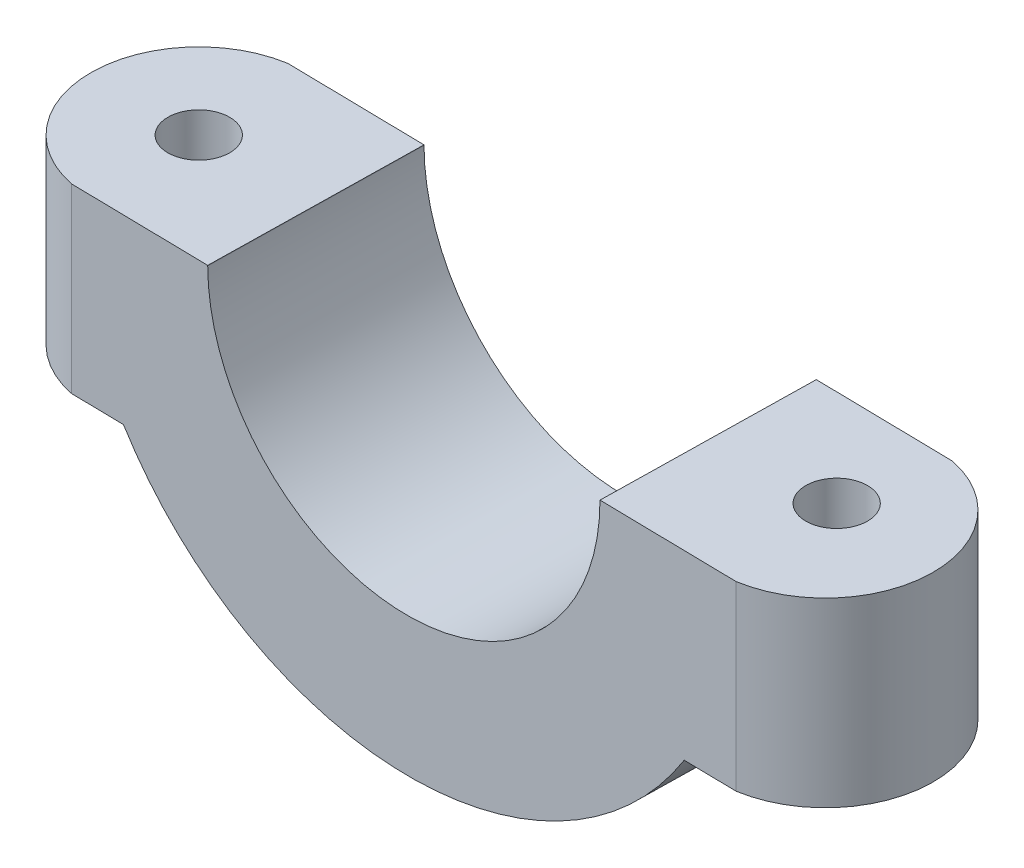
ISO-10303-21;
HEADER;
FILE_DESCRIPTION(('STEP AP214'),'2;1');
FILE_NAME('part.step','',(''),(''),'','','');
FILE_SCHEMA(('AUTOMOTIVE_DESIGN { 1 0 10303 214 1 1 1 1 }'));
ENDSEC;
DATA;
#1=APPLICATION_CONTEXT('core data for automotive mechanical design processes');
#2=APPLICATION_PROTOCOL_DEFINITION('international standard','automotive_design',2000,#1);
#3=PRODUCT_CONTEXT('',#1,'mechanical');
#4=PRODUCT('Part','Part','',(#3));
#5=PRODUCT_RELATED_PRODUCT_CATEGORY('part','',(#4));
#6=PRODUCT_DEFINITION_FORMATION('','',#4);
#7=PRODUCT_DEFINITION_CONTEXT('part definition',#1,'design');
#8=PRODUCT_DEFINITION('design','',#6,#7);
#9=PRODUCT_DEFINITION_SHAPE('','',#8);
#10=(LENGTH_UNIT() NAMED_UNIT(*) SI_UNIT(.MILLI.,.METRE.));
#11=(NAMED_UNIT(*) PLANE_ANGLE_UNIT() SI_UNIT($,.RADIAN.));
#12=(NAMED_UNIT(*) SI_UNIT($,.STERADIAN.) SOLID_ANGLE_UNIT());
#13=UNCERTAINTY_MEASURE_WITH_UNIT(LENGTH_MEASURE(1.E-05),#10,'distance_accuracy_value','');
#14=(GEOMETRIC_REPRESENTATION_CONTEXT(3) GLOBAL_UNCERTAINTY_ASSIGNED_CONTEXT((#13)) GLOBAL_UNIT_ASSIGNED_CONTEXT((#10,
#11,#12)) REPRESENTATION_CONTEXT('',''));
#15=CARTESIAN_POINT('',(0.,0.,0.));
#16=DIRECTION('',(0.,0.,1.));
#17=DIRECTION('',(1.,0.,0.));
#18=AXIS2_PLACEMENT_3D('',#15,#16,#17);
#19=CARTESIAN_POINT('',(-17.5642585339829,10.0011602048768,-0.312946842197242));
#20=DIRECTION('',(0.,-1.,0.));
#21=DIRECTION('',(0.,0.,-1.));
#22=AXIS2_PLACEMENT_3D('',#19,#20,#21);
#23=CYLINDRICAL_SURFACE('',#22,1.7);
#24=CARTESIAN_POINT('',(-17.5642585339829,10.,-0.312946842197242));
#25=DIRECTION('',(0.,1.,0.));
#26=DIRECTION('',(0.,0.,1.));
#27=AXIS2_PLACEMENT_3D('',#24,#25,#26);
#28=CIRCLE('',#27,1.7);
#29=CARTESIAN_POINT('',(-17.5642585339829,10.,1.38705315780276));
#30=VERTEX_POINT('',#29);
#31=EDGE_CURVE('E283',#30,#30,#28,.T.);
#32=ORIENTED_EDGE('',*,*,#31,.T.);
#33=EDGE_LOOP('',(#32));
#34=FACE_BOUND('',#33,.T.);
#35=CARTESIAN_POINT('',(-17.5642585339829,2.4,-0.312946842197242));
#36=DIRECTION('',(0.,-1.,0.));
#37=DIRECTION('',(0.,0.,-1.));
#38=AXIS2_PLACEMENT_3D('',#35,#36,#37);
#39=CIRCLE('',#38,1.7);
#40=CARTESIAN_POINT('',(-17.5642585339829,2.4,-2.01294684219724));
#41=VERTEX_POINT('',#40);
#42=EDGE_CURVE('E277',#41,#41,#39,.F.);
#43=ORIENTED_EDGE('',*,*,#42,.F.);
#44=EDGE_LOOP('',(#43));
#45=FACE_BOUND('',#44,.T.);
#46=ADVANCED_FACE('F35',(#34,#45),#23,.F.);
#47=CARTESIAN_POINT('',(0.851329498538715,10.,-47.5096853934283));
#48=DIRECTION('',(-0.0179161963788297,0.,0.99983949207226));
#49=DIRECTION('',(0.99983949207226,0.,0.0179161963788297));
#50=AXIS2_PLACEMENT_3D('',#47,#48,#49);
#51=CYLINDRICAL_SURFACE('',#50,18.6341884195745);
#52=CARTESIAN_POINT('',(-0.12045017804225,10.,6.72189801268763));
#53=DIRECTION('',(-0.5,0.,-0.866025403784439));
#54=DIRECTION('',(-0.866025403784439,0.,0.5));
#55=AXIS2_PLACEMENT_3D('',#52,#53,#54);
#56=ELLIPSE('',#55,21.7453296660283,18.6341884195745);
#57=CARTESIAN_POINT('',(14.8142585339829,-1.35115737945266,-1.90066008246871));
#58=VERTEX_POINT('',#57);
#59=CARTESIAN_POINT('',(15.7701150497485,0.,-2.45252409915266));
#60=VERTEX_POINT('',#59);
#61=EDGE_CURVE('E281',#58,#60,#56,.F.);
#62=ORIENTED_EDGE('',*,*,#61,.F.);
#63=CARTESIAN_POINT('',(14.8142585339829,10.,-826.731322589581));
#64=DIRECTION('',(-1.,0.,0.));
#65=DIRECTION('',(0.,0.,1.));
#66=AXIS2_PLACEMENT_3D('',#63,#64,#65);
#67=ELLIPSE('',#66,1040.07502628142,18.6341884195745);
#68=CARTESIAN_POINT('',(14.8142585339829,-1.27670473504071,1.27476639807423));
#69=VERTEX_POINT('',#68);
#70=EDGE_CURVE('E11',#69,#58,#67,.F.);
#71=ORIENTED_EDGE('',*,*,#70,.F.);
#72=CARTESIAN_POINT('',(0.129084035860714,10.,-7.20372305151324));
#73=DIRECTION('',(-0.5,0.,0.866025403784438));
#74=DIRECTION('',(0.866025403784438,0.,0.500000000000001));
#75=AXIS2_PLACEMENT_3D('',#72,#73,#74);
#76=ELLIPSE('',#75,21.3000006989995,18.6341884195745);
#77=CARTESIAN_POINT('',(15.6942217301498,0.,1.78281338625817));
#78=VERTEX_POINT('',#77);
#79=EDGE_CURVE('E279',#78,#69,#76,.F.);
#80=ORIENTED_EDGE('',*,*,#79,.F.);
#81=DIRECTION('',(-0.0179161963788297,0.,0.99983949207226));
#82=VECTOR('',#81,1.);
#83=CARTESIAN_POINT('',(16.5724496469144,0.,-47.2279775012048));
#84=LINE('',#83,#82);
#85=CARTESIAN_POINT('',(15.6162463227518,0.,6.13434482063357));
#86=VERTEX_POINT('',#85);
#87=EDGE_CURVE('E378',#86,#78,#84,.F.);
#88=ORIENTED_EDGE('',*,*,#87,.F.);
#89=CARTESIAN_POINT('',(-0.104873825623811,10.,5.85263692841008));
#90=DIRECTION('',(-0.0179161963788297,0.,0.99983949207226));
#91=DIRECTION('',(0.99983949207226,0.,0.0179161963788297));
#92=AXIS2_PLACEMENT_3D('',#89,#90,#91);
#93=CIRCLE('',#92,18.6341884195745);
#94=CARTESIAN_POINT('',(-15.8259939739995,0.,5.5709290361866));
#95=VERTEX_POINT('',#94);
#96=EDGE_CURVE('E351',#95,#86,#93,.T.);
#97=ORIENTED_EDGE('',*,*,#96,.F.);
#98=DIRECTION('',(-0.0179161963788297,0.,0.99983949207226));
#99=VECTOR('',#98,1.);
#100=CARTESIAN_POINT('',(-14.8697906498369,0.,-47.7913932856518));
#101=LINE('',#100,#99);
#102=CARTESIAN_POINT('',(-15.7587823722839,0.,1.82008749037332));
#103=VERTEX_POINT('',#102);
#104=EDGE_CURVE('E394',#95,#103,#101,.F.);
#105=ORIENTED_EDGE('',*,*,#104,.T.);
#106=CARTESIAN_POINT('',(0.131782855506878,10.,-7.35433462146697));
#107=DIRECTION('',(0.5,0.,0.866025403784439));
#108=DIRECTION('',(-0.866025403784439,0.,0.5));
#109=AXIS2_PLACEMENT_3D('',#106,#107,#108);
#110=ELLIPSE('',#109,21.7453296660283,18.6341884195745);
#111=CARTESIAN_POINT('',(-14.8142585339829,-1.33654364393422,1.27476639807423));
#112=VERTEX_POINT('',#111);
#113=EDGE_CURVE('E276',#112,#103,#110,.F.);
#114=ORIENTED_EDGE('',*,*,#113,.F.);
#115=CARTESIAN_POINT('',(-14.8142585339829,10.,826.731322589581));
#116=DIRECTION('',(1.,0.,0.));
#117=DIRECTION('',(0.,0.,1.));
#118=AXIS2_PLACEMENT_3D('',#115,#116,#117);
#119=ELLIPSE('',#118,1040.07502628142,18.6341884195745);
#120=CARTESIAN_POINT('',(-14.8142585339829,-1.26193774164251,-1.90066008246871));
#121=VERTEX_POINT('',#120);
#122=EDGE_CURVE('E43',#121,#112,#119,.F.);
#123=ORIENTED_EDGE('',*,*,#122,.F.);
#124=CARTESIAN_POINT('',(-0.117983443612844,10.,6.58423829704122));
#125=DIRECTION('',(0.5,0.,-0.866025403784438));
#126=DIRECTION('',(0.866025403784439,0.,0.5));
#127=AXIS2_PLACEMENT_3D('',#124,#125,#126);
#128=ELLIPSE('',#127,21.3000006989995,18.6341884195745);
#129=CARTESIAN_POINT('',(-15.6831211379019,0.,-2.40229814073019));
#130=VERTEX_POINT('',#129);
#131=EDGE_CURVE('E274',#130,#121,#128,.F.);
#132=ORIENTED_EDGE('',*,*,#131,.F.);
#133=CARTESIAN_POINT('',(-15.6163103944167,0.,-6.13076920784937));
#134=VERTEX_POINT('',#133);
#135=EDGE_CURVE('E383',#130,#134,#101,.F.);
#136=ORIENTED_EDGE('',*,*,#135,.T.);
#137=CARTESIAN_POINT('',(0.104809753958985,10.,-5.84906131562588));
#138=DIRECTION('',(-0.0179161963788298,0.,0.99983949207226));
#139=DIRECTION('',(0.99983949207226,0.,0.0179161963788298));
#140=AXIS2_PLACEMENT_3D('',#137,#138,#139);
#141=CIRCLE('',#140,18.6341884195745);
#142=CARTESIAN_POINT('',(15.8259299023346,0.,-5.5673534234024));
#143=VERTEX_POINT('',#142);
#144=EDGE_CURVE('E368',#143,#134,#141,.F.);
#145=ORIENTED_EDGE('',*,*,#144,.F.);
#146=EDGE_CURVE('E377',#60,#143,#84,.F.);
#147=ORIENTED_EDGE('',*,*,#146,.F.);
#148=EDGE_LOOP('',(#62,#71,#80,#88,#97,#105,#114,#123,#132,#136,#145,#147));
#149=FACE_BOUND('',#148,.T.);
#150=ADVANCED_FACE('F473',(#149),#51,.T.);
#151=CARTESIAN_POINT('',(0.851329498538715,10.,-47.5096853934283));
#152=DIRECTION('',(-0.0179161963788297,0.,0.99983949207226));
#153=DIRECTION('',(0.99983949207226,0.,0.0179161963788297));
#154=AXIS2_PLACEMENT_3D('',#151,#152,#153);
#155=CYLINDRICAL_SURFACE('',#154,11.);
#156=CARTESIAN_POINT('',(0.104809753958985,10.,-5.84906131562588));
#157=DIRECTION('',(-0.0179161963788298,0.,0.99983949207226));
#158=DIRECTION('',(0.99983949207226,0.,0.0179161963788298));
#159=AXIS2_PLACEMENT_3D('',#156,#157,#158);
#160=CIRCLE('',#159,11.);
#161=CARTESIAN_POINT('',(-10.8933926230034,9.97345003897609,-6.0461389017406));
#162=VERTEX_POINT('',#161);
#163=CARTESIAN_POINT('',(11.1030441667539,10.,-5.65198315545876));
#164=VERTEX_POINT('',#163);
#165=EDGE_CURVE('E343',#162,#164,#160,.T.);
#166=ORIENTED_EDGE('',*,*,#165,.F.);
#167=DIRECTION('',(-0.0179161963788297,0.,0.99983949207226));
#168=VECTOR('',#167,1.);
#169=CARTESIAN_POINT('',(-10.1468728784237,9.97345003897328,-47.706762979543));
#170=LINE('',#169,#168);
#171=CARTESIAN_POINT('',(-11.1030762025862,9.97345003897328,5.65555934229537));
#172=VERTEX_POINT('',#171);
#173=EDGE_CURVE('E381',#162,#172,#170,.T.);
#174=ORIENTED_EDGE('',*,*,#173,.T.);
#175=CARTESIAN_POINT('',(-0.104873825623811,10.,5.85263692841008));
#176=DIRECTION('',(0.0179161963788297,0.,-0.99983949207226));
#177=DIRECTION('',(0.99983949207226,0.,0.0179161963788297));
#178=AXIS2_PLACEMENT_3D('',#175,#176,#177);
#179=CIRCLE('',#178,11.);
#180=CARTESIAN_POINT('',(10.8933605871711,10.,6.04971508857721));
#181=VERTEX_POINT('',#180);
#182=EDGE_CURVE('E347',#181,#172,#179,.T.);
#183=ORIENTED_EDGE('',*,*,#182,.F.);
#184=DIRECTION('',(-0.0179161963788297,0.,0.99983949207226));
#185=VECTOR('',#184,1.);
#186=CARTESIAN_POINT('',(11.8495639113336,10.,-47.3126072332612));
#187=LINE('',#186,#185);
#188=EDGE_CURVE('E346',#164,#181,#187,.T.);
#189=ORIENTED_EDGE('',*,*,#188,.F.);
#190=EDGE_LOOP('',(#166,#174,#183,#189));
#191=FACE_BOUND('',#190,.T.);
#192=ADVANCED_FACE('F501',(#191),#155,.F.);
#193=CARTESIAN_POINT('',(17.5642585339831,10.,0.316523603086257));
#194=DIRECTION('',(0.,-1.,0.));
#195=DIRECTION('',(0.,0.,-1.));
#196=AXIS2_PLACEMENT_3D('',#193,#194,#195);
#197=CYLINDRICAL_SURFACE('',#196,5.94828404765475);
#198=CARTESIAN_POINT('',(17.5642585339831,0.,0.316523603086257));
#199=DIRECTION('',(0.,1.,0.));
#200=DIRECTION('',(0.,0.,1.));
#201=AXIS2_PLACEMENT_3D('',#198,#199,#200);
#202=CIRCLE('',#201,5.94828404765475);
#203=CARTESIAN_POINT('',(18.5263236589823,0.,6.18649070749529));
#204=VERTEX_POINT('',#203);
#205=CARTESIAN_POINT('',(18.7360072385651,0.,-5.51520753654067));
#206=VERTEX_POINT('',#205);
#207=EDGE_CURVE('E364',#204,#206,#202,.T.);
#208=ORIENTED_EDGE('',*,*,#207,.T.);
#209=DIRECTION('',(0.,-1.,0.));
#210=VECTOR('',#209,1.);
#211=CARTESIAN_POINT('',(18.7360072385651,10.,-5.51520753654067));
#212=LINE('',#211,#210);
#213=CARTESIAN_POINT('',(18.7360072385651,10.,-5.51520753654067));
#214=VERTEX_POINT('',#213);
#215=EDGE_CURVE('E374',#214,#206,#212,.T.);
#216=ORIENTED_EDGE('',*,*,#215,.F.);
#217=CARTESIAN_POINT('',(17.5642585339831,10.,0.316523603086257));
#218=DIRECTION('',(0.,1.,0.));
#219=DIRECTION('',(0.,0.,1.));
#220=AXIS2_PLACEMENT_3D('',#217,#218,#219);
#221=CIRCLE('',#220,5.94828404765475);
#222=CARTESIAN_POINT('',(18.5263236589823,10.,6.18649070749529));
#223=VERTEX_POINT('',#222);
#224=EDGE_CURVE('E354',#223,#214,#221,.T.);
#225=ORIENTED_EDGE('',*,*,#224,.F.);
#226=DIRECTION('',(0.,-1.,0.));
#227=VECTOR('',#226,1.);
#228=CARTESIAN_POINT('',(18.5263236589823,10.,6.18649070749529));
#229=LINE('',#228,#227);
#230=EDGE_CURVE('E363',#223,#204,#229,.T.);
#231=ORIENTED_EDGE('',*,*,#230,.T.);
#232=EDGE_LOOP('',(#208,#216,#225,#231));
#233=FACE_BOUND('',#232,.T.);
#234=ADVANCED_FACE('F37',(#233),#197,.T.);
#235=CARTESIAN_POINT('',(18.7360072385651,10.,-5.51520753654067));
#236=DIRECTION('',(-0.0179161963788298,0.,0.99983949207226));
#237=DIRECTION('',(0.99983949207226,0.,0.0179161963788298));
#238=AXIS2_PLACEMENT_3D('',#235,#236,#237);
#239=PLANE('',#238);
#240=DIRECTION('',(0.,-1.,0.));
#241=VECTOR('',#240,1.);
#242=CARTESIAN_POINT('',(-10.8933926230034,10.,-6.0461389017406));
#243=LINE('',#242,#241);
#244=CARTESIAN_POINT('',(-10.8933926230034,10.,-6.0461389017406));
#245=VERTEX_POINT('',#244);
#246=EDGE_CURVE('E487',#245,#162,#243,.T.);
#247=ORIENTED_EDGE('',*,*,#246,.T.);
#248=ORIENTED_EDGE('',*,*,#165,.T.);
#249=DIRECTION('',(-0.99983949207226,0.,-0.0179161963788298));
#250=VECTOR('',#249,1.);
#251=CARTESIAN_POINT('',(18.7360072385651,10.,-5.51520753654067));
#252=LINE('',#251,#250);
#253=EDGE_CURVE('E357',#214,#164,#252,.T.);
#254=ORIENTED_EDGE('',*,*,#253,.F.);
#255=ORIENTED_EDGE('',*,*,#215,.T.);
#256=DIRECTION('',(-0.99983949207226,0.,-0.0179161963788298));
#257=VECTOR('',#256,1.);
#258=CARTESIAN_POINT('',(18.7360072385651,0.,-5.51520753654067));
#259=LINE('',#258,#257);
#260=EDGE_CURVE('E367',#206,#143,#259,.T.);
#261=ORIENTED_EDGE('',*,*,#260,.T.);
#262=ORIENTED_EDGE('',*,*,#144,.T.);
#263=DIRECTION('',(-0.99983949207226,0.,-0.0179161963788298));
#264=VECTOR('',#263,1.);
#265=CARTESIAN_POINT('',(-10.8933926230034,0.,-6.0461389017406));
#266=LINE('',#265,#264);
#267=CARTESIAN_POINT('',(-18.5263236589821,0.,-6.18291394660628));
#268=VERTEX_POINT('',#267);
#269=EDGE_CURVE('E299',#134,#268,#266,.T.);
#270=ORIENTED_EDGE('',*,*,#269,.T.);
#271=DIRECTION('',(0.,-1.,0.));
#272=VECTOR('',#271,1.);
#273=CARTESIAN_POINT('',(-18.5263236589821,10.,-6.18291394660628));
#274=LINE('',#273,#272);
#275=CARTESIAN_POINT('',(-18.5263236589821,9.95113051891698,-6.18291394660628));
#276=VERTEX_POINT('',#275);
#277=EDGE_CURVE('E311',#276,#268,#274,.T.);
#278=ORIENTED_EDGE('',*,*,#277,.F.);
#279=CARTESIAN_POINT('',(-18.5263879400115,10.,-6.18290341083036));
#280=CARTESIAN_POINT('',(-18.5263852616376,9.99796377162161,-6.18290384983569));
#281=CARTESIAN_POINT('',(-18.5263825832635,9.99592754324322,-6.18290428883918));
#282=CARTESIAN_POINT('',(-18.5263772265147,9.99185508648644,-6.18290516684251));
#283=CARTESIAN_POINT('',(-18.52637454814,9.98981885810805,-6.18290560584234));
#284=CARTESIAN_POINT('',(-18.5263691913899,9.98574640135127,-6.18290648383833));
#285=CARTESIAN_POINT('',(-18.5263665130146,9.98371017297288,-6.18290692283449));
#286=CARTESIAN_POINT('',(-18.5263611562634,9.9796377162161,-6.18290780082315));
#287=CARTESIAN_POINT('',(-18.5263584778874,9.97760148783771,-6.18290823981565));
#288=CARTESIAN_POINT('',(-18.526353121135,9.97352903108093,-6.18290911779697));
#289=CARTESIAN_POINT('',(-18.5263504427585,9.97149280270255,-6.1829095567858));
#290=CARTESIAN_POINT('',(-18.5263450860048,9.96742034594577,-6.1829104347598));
#291=CARTESIAN_POINT('',(-18.5263424076277,9.96538411756738,-6.18291087374496));
#292=CARTESIAN_POINT('',(-18.5263370508728,9.9613116608106,-6.18291175171162));
#293=CARTESIAN_POINT('',(-18.5263343724951,9.95927543243221,-6.18291219069312));
#294=CARTESIAN_POINT('',(-18.5263290157391,9.95520297567543,-6.18291306865245));
#295=CARTESIAN_POINT('',(-18.5263263373607,9.95316674729704,-6.18291350763028));
#296=CARTESIAN_POINT('',(-18.5263236589821,9.95113051891865,-6.18291394660628));
#297=B_SPLINE_CURVE_WITH_KNOTS('',3,(#279,#280,#281,#282,#283,#284,#285,#286,#287,#288,#289,
#290,#291,#292,#293,#294,#295,#296),.UNSPECIFIED.,.F.,.F.,(4,2,2,2,2,2,2,2,4),(0.,
0.00610869056167826,0.0122173811233583,0.0183260716850365,0.0244347622467148,0.0305434528083931,
0.0366521433700713,0.0427608339317513,0.0488695244934296),.UNSPECIFIED.);
#298=CARTESIAN_POINT('',(-18.5263556948146,10.,-6.18291452065869));
#299=VERTEX_POINT('',#298);
#300=EDGE_CURVE('E305',#299,#276,#297,.T.);
#301=ORIENTED_EDGE('',*,*,#300,.F.);
#302=DIRECTION('',(0.99983949207226,0.,0.0179161963788298));
#303=VECTOR('',#302,1.);
#304=CARTESIAN_POINT('',(-10.8934246588359,10.,-6.04613947579301));
#305=LINE('',#304,#303);
#306=EDGE_CURVE('E345',#299,#245,#305,.T.);
#307=ORIENTED_EDGE('',*,*,#306,.T.);
#308=EDGE_LOOP('',(#247,#248,#254,#255,#261,#262,#270,#278,#301,#307));
#309=FACE_BOUND('',#308,.T.);
#310=ADVANCED_FACE('F408',(#309),#239,.F.);
#311=CARTESIAN_POINT('',(10.8933926230035,10.,6.04971566262962));
#312=DIRECTION('',(0.0179161963788297,0.,-0.99983949207226));
#313=DIRECTION('',(-0.99983949207226,0.,-0.0179161963788297));
#314=AXIS2_PLACEMENT_3D('',#311,#312,#313);
#315=PLANE('',#314);
#316=ORIENTED_EDGE('',*,*,#182,.T.);
#317=DIRECTION('',(0.,-1.,0.));
#318=VECTOR('',#317,1.);
#319=CARTESIAN_POINT('',(-11.1030762025862,10.,5.65555934229536));
#320=LINE('',#319,#318);
#321=CARTESIAN_POINT('',(-11.1030762025862,10.,5.65555934229536));
#322=VERTEX_POINT('',#321);
#323=EDGE_CURVE('E342',#322,#172,#320,.T.);
#324=ORIENTED_EDGE('',*,*,#323,.F.);
#325=DIRECTION('',(-0.99983949207226,0.,-0.0179161963788297));
#326=VECTOR('',#325,1.);
#327=CARTESIAN_POINT('',(-11.1031082384187,10.,5.65555876824296));
#328=LINE('',#327,#326);
#329=CARTESIAN_POINT('',(-18.736060363199,10.,5.51877362299413));
#330=VERTEX_POINT('',#329);
#331=EDGE_CURVE('E350',#322,#330,#328,.T.);
#332=ORIENTED_EDGE('',*,*,#331,.T.);
#333=CARTESIAN_POINT('',(-18.7360072385649,10.,5.51878429742968));
#334=DIRECTION('',(0.,-1.,0.));
#335=VECTOR('',#334,1.);
#336=LINE('',#333,#335);
#337=CARTESIAN_POINT('',(-18.7360072385649,9.95113051891976,5.51878429742968));
#338=VERTEX_POINT('',#337);
#339=EDGE_CURVE('E341',#330,#338,#336,.T.);
#340=ORIENTED_EDGE('',*,*,#339,.T.);
#341=DIRECTION('',(0.,-1.,0.));
#342=VECTOR('',#341,1.);
#343=CARTESIAN_POINT('',(-18.7360072385649,10.,5.51878429742968));
#344=LINE('',#343,#342);
#345=CARTESIAN_POINT('',(-18.7360072385649,0.,5.51878429742968));
#346=VERTEX_POINT('',#345);
#347=EDGE_CURVE('E334',#338,#346,#344,.T.);
#348=ORIENTED_EDGE('',*,*,#347,.T.);
#349=DIRECTION('',(0.99983949207226,0.,0.0179161963788302));
#350=VECTOR('',#349,1.);
#351=CARTESIAN_POINT('',(-18.7360072385649,0.,5.51878429742968));
#352=LINE('',#351,#350);
#353=EDGE_CURVE('E480',#346,#95,#352,.T.);
#354=ORIENTED_EDGE('',*,*,#353,.T.);
#355=ORIENTED_EDGE('',*,*,#96,.T.);
#356=DIRECTION('',(0.99983949207226,0.,0.0179161963788297));
#357=VECTOR('',#356,1.);
#358=CARTESIAN_POINT('',(10.8933926230035,0.,6.04971566262962));
#359=LINE('',#358,#357);
#360=EDGE_CURVE('E358',#86,#204,#359,.T.);
#361=ORIENTED_EDGE('',*,*,#360,.T.);
#362=ORIENTED_EDGE('',*,*,#230,.F.);
#363=DIRECTION('',(0.99983949207226,0.,0.0179161963788297));
#364=VECTOR('',#363,1.);
#365=CARTESIAN_POINT('',(10.8933926230035,10.,6.04971566262962));
#366=LINE('',#365,#364);
#367=EDGE_CURVE('E361',#181,#223,#366,.T.);
#368=ORIENTED_EDGE('',*,*,#367,.F.);
#369=EDGE_LOOP('',(#316,#324,#332,#340,#348,#354,#355,#361,#362,#368));
#370=FACE_BOUND('',#369,.T.);
#371=ADVANCED_FACE('F417',(#370),#315,.F.);
#372=CARTESIAN_POINT('',(17.5642585339831,10.,0.316523603086257));
#373=DIRECTION('',(0.,1.,0.));
#374=DIRECTION('',(0.,0.,1.));
#375=AXIS2_PLACEMENT_3D('',#372,#373,#374);
#376=PLANE('',#375);
#377=CARTESIAN_POINT('',(17.5642585339829,10.,-0.312946842197237));
#378=DIRECTION('',(0.,1.,0.));
#379=DIRECTION('',(0.,0.,1.));
#380=AXIS2_PLACEMENT_3D('',#377,#378,#379);
#381=CIRCLE('',#380,1.7);
#382=CARTESIAN_POINT('',(17.5642585339829,10.,1.38705315780276));
#383=VERTEX_POINT('',#382);
#384=EDGE_CURVE('E286',#383,#383,#381,.T.);
#385=ORIENTED_EDGE('',*,*,#384,.F.);
#386=EDGE_LOOP('',(#385));
#387=FACE_BOUND('',#386,.T.);
#388=ORIENTED_EDGE('',*,*,#224,.T.);
#389=ORIENTED_EDGE('',*,*,#253,.T.);
#390=ORIENTED_EDGE('',*,*,#188,.T.);
#391=ORIENTED_EDGE('',*,*,#367,.T.);
#392=EDGE_LOOP('',(#388,#389,#390,#391));
#393=FACE_BOUND('',#392,.T.);
#394=ADVANCED_FACE('F421',(#387,#393),#376,.T.);
#395=CARTESIAN_POINT('',(17.5642585339831,0.,0.316523603086257));
#396=DIRECTION('',(0.,1.,0.));
#397=DIRECTION('',(0.,0.,1.));
#398=AXIS2_PLACEMENT_3D('',#395,#396,#397);
#399=PLANE('',#398);
#400=DIRECTION('',(-0.866025403784439,0.,-0.5));
#401=VECTOR('',#400,1.);
#402=CARTESIAN_POINT('',(19.2118272322565,0.,-2.53714909128347));
#403=LINE('',#402,#401);
#404=CARTESIAN_POINT('',(20.3142585339829,0.,-1.90066008246871));
#405=VERTEX_POINT('',#404);
#406=CARTESIAN_POINT('',(17.5642585339829,0.,-3.48837332274018));
#407=VERTEX_POINT('',#406);
#408=EDGE_CURVE('E457',#405,#407,#403,.T.);
#409=ORIENTED_EDGE('',*,*,#408,.T.);
#410=DIRECTION('',(-0.866025403784439,0.,0.5));
#411=VECTOR('',#410,1.);
#412=CARTESIAN_POINT('',(15.9166898357095,0.,-2.53714909128366));
#413=LINE('',#412,#411);
#414=EDGE_CURVE('E460',#407,#60,#413,.T.);
#415=ORIENTED_EDGE('',*,*,#414,.T.);
#416=ORIENTED_EDGE('',*,*,#146,.T.);
#417=ORIENTED_EDGE('',*,*,#260,.F.);
#418=ORIENTED_EDGE('',*,*,#207,.F.);
#419=ORIENTED_EDGE('',*,*,#360,.F.);
#420=ORIENTED_EDGE('',*,*,#87,.T.);
#421=DIRECTION('',(0.866025403784438,0.,0.500000000000001));
#422=VECTOR('',#421,1.);
#423=CARTESIAN_POINT('',(16.4618272322565,0.,2.22599062953093));
#424=LINE('',#423,#422);
#425=CARTESIAN_POINT('',(17.5642585339829,0.,2.8624796383457));
#426=VERTEX_POINT('',#425);
#427=EDGE_CURVE('E453',#78,#426,#424,.T.);
#428=ORIENTED_EDGE('',*,*,#427,.T.);
#429=DIRECTION('',(0.866025403784439,0.,-0.5));
#430=VECTOR('',#429,1.);
#431=CARTESIAN_POINT('',(18.6666898357095,0.,2.22599062953074));
#432=LINE('',#431,#430);
#433=CARTESIAN_POINT('',(20.3142585339829,0.,1.27476639807423));
#434=VERTEX_POINT('',#433);
#435=EDGE_CURVE('E451',#426,#434,#432,.T.);
#436=ORIENTED_EDGE('',*,*,#435,.T.);
#437=DIRECTION('',(0.,0.,-1.));
#438=VECTOR('',#437,1.);
#439=CARTESIAN_POINT('',(20.3142585339829,0.,0.316523603086263));
#440=LINE('',#439,#438);
#441=EDGE_CURVE('E200',#434,#405,#440,.T.);
#442=ORIENTED_EDGE('',*,*,#441,.T.);
#443=EDGE_LOOP('',(#409,#415,#416,#417,#418,#419,#420,#428,#436,#442));
#444=FACE_BOUND('',#443,.T.);
#445=ADVANCED_FACE('F423',(#444),#399,.F.);
#446=CARTESIAN_POINT('',(-10.1469049142562,10.,-47.7067635535954));
#447=DIRECTION('',(0.,1.,0.));
#448=DIRECTION('',(0.,0.,1.));
#449=AXIS2_PLACEMENT_3D('',#446,#447,#448);
#450=PLANE('',#449);
#451=ORIENTED_EDGE('',*,*,#31,.F.);
#452=EDGE_LOOP('',(#451));
#453=FACE_BOUND('',#452,.T.);
#454=ORIENTED_EDGE('',*,*,#306,.F.);
#455=CARTESIAN_POINT('',(-17.5642585339829,10.,-0.312946842197242));
#456=DIRECTION('',(0.,1.,0.));
#457=DIRECTION('',(0.,0.,1.));
#458=AXIS2_PLACEMENT_3D('',#455,#456,#457);
#459=CIRCLE('',#458,5.94828404765475);
#460=EDGE_CURVE('E295',#299,#330,#459,.T.);
#461=ORIENTED_EDGE('',*,*,#460,.T.);
#462=ORIENTED_EDGE('',*,*,#331,.F.);
#463=DIRECTION('',(0.0179161963788299,0.,-0.99983949207226));
#464=VECTOR('',#463,1.);
#465=CARTESIAN_POINT('',(-11.1030762025862,10.,5.65555934229536));
#466=LINE('',#465,#464);
#467=EDGE_CURVE('E292',#322,#245,#466,.T.);
#468=ORIENTED_EDGE('',*,*,#467,.T.);
#469=EDGE_LOOP('',(#454,#461,#462,#468));
#470=FACE_BOUND('',#469,.T.);
#471=ADVANCED_FACE('F327',(#453,#470),#450,.T.);
#472=CARTESIAN_POINT('',(-11.1030762025862,10.,5.65555934229536));
#473=DIRECTION('',(-0.99983949207226,0.,-0.0179161963788299));
#474=DIRECTION('',(-0.0179161963788299,0.,0.99983949207226));
#475=AXIS2_PLACEMENT_3D('',#472,#473,#474);
#476=PLANE('',#475);
#477=ORIENTED_EDGE('',*,*,#173,.F.);
#478=ORIENTED_EDGE('',*,*,#246,.F.);
#479=ORIENTED_EDGE('',*,*,#467,.F.);
#480=ORIENTED_EDGE('',*,*,#323,.T.);
#481=EDGE_LOOP('',(#477,#478,#479,#480));
#482=FACE_BOUND('',#481,.T.);
#483=ADVANCED_FACE('F325',(#482),#476,.F.);
#484=CARTESIAN_POINT('',(-17.5642585339829,10.,-0.312946842197242));
#485=DIRECTION('',(0.,-1.,0.));
#486=DIRECTION('',(0.,0.,-1.));
#487=AXIS2_PLACEMENT_3D('',#484,#485,#486);
#488=CYLINDRICAL_SURFACE('',#487,5.94828404765475);
#489=ORIENTED_EDGE('',*,*,#339,.F.);
#490=ORIENTED_EDGE('',*,*,#460,.F.);
#491=ORIENTED_EDGE('',*,*,#300,.T.);
#492=ORIENTED_EDGE('',*,*,#277,.T.);
#493=CARTESIAN_POINT('',(-17.5642585339829,0.,-0.312946842197242));
#494=DIRECTION('',(0.,1.,0.));
#495=DIRECTION('',(0.,0.,1.));
#496=AXIS2_PLACEMENT_3D('',#493,#494,#495);
#497=CIRCLE('',#496,5.94828404765475);
#498=EDGE_CURVE('E289',#268,#346,#497,.T.);
#499=ORIENTED_EDGE('',*,*,#498,.T.);
#500=ORIENTED_EDGE('',*,*,#347,.F.);
#501=EDGE_LOOP('',(#489,#490,#491,#492,#499,#500));
#502=FACE_BOUND('',#501,.T.);
#503=ADVANCED_FACE('F314',(#502),#488,.T.);
#504=CARTESIAN_POINT('',(-17.5642585339829,0.,-0.312946842197242));
#505=DIRECTION('',(0.,1.,0.));
#506=DIRECTION('',(0.,0.,1.));
#507=AXIS2_PLACEMENT_3D('',#504,#505,#506);
#508=PLANE('',#507);
#509=DIRECTION('',(0.866025403784439,0.,0.5));
#510=VECTOR('',#509,1.);
#511=CARTESIAN_POINT('',(-18.9392585339829,0.,2.06862301820996));
#512=LINE('',#511,#510);
#513=CARTESIAN_POINT('',(-20.3142585339829,0.,1.27476639807423));
#514=VERTEX_POINT('',#513);
#515=CARTESIAN_POINT('',(-17.5642585339829,0.,2.8624796383457));
#516=VERTEX_POINT('',#515);
#517=EDGE_CURVE('E445',#514,#516,#512,.T.);
#518=ORIENTED_EDGE('',*,*,#517,.T.);
#519=DIRECTION('',(0.866025403784439,0.,-0.5));
#520=VECTOR('',#519,1.);
#521=CARTESIAN_POINT('',(-16.1892585339829,0.,2.06862301820996));
#522=LINE('',#521,#520);
#523=EDGE_CURVE('E448',#516,#103,#522,.T.);
#524=ORIENTED_EDGE('',*,*,#523,.T.);
#525=ORIENTED_EDGE('',*,*,#104,.F.);
#526=ORIENTED_EDGE('',*,*,#353,.F.);
#527=ORIENTED_EDGE('',*,*,#498,.F.);
#528=ORIENTED_EDGE('',*,*,#269,.F.);
#529=ORIENTED_EDGE('',*,*,#135,.F.);
#530=DIRECTION('',(-0.866025403784439,0.,-0.5));
#531=VECTOR('',#530,1.);
#532=CARTESIAN_POINT('',(-16.1892585339829,0.,-2.69451670260445));
#533=LINE('',#532,#531);
#534=CARTESIAN_POINT('',(-17.5642585339829,0.,-3.48837332274018));
#535=VERTEX_POINT('',#534);
#536=EDGE_CURVE('E397',#130,#535,#533,.T.);
#537=ORIENTED_EDGE('',*,*,#536,.T.);
#538=DIRECTION('',(-0.866025403784439,0.,0.5));
#539=VECTOR('',#538,1.);
#540=CARTESIAN_POINT('',(-18.9392585339829,0.,-2.69451670260445));
#541=LINE('',#540,#539);
#542=CARTESIAN_POINT('',(-20.3142585339829,0.,-1.90066008246871));
#543=VERTEX_POINT('',#542);
#544=EDGE_CURVE('E439',#535,#543,#541,.T.);
#545=ORIENTED_EDGE('',*,*,#544,.T.);
#546=DIRECTION('',(0.,0.,1.));
#547=VECTOR('',#546,1.);
#548=CARTESIAN_POINT('',(-20.3142585339829,0.,-0.312946842197242));
#549=LINE('',#548,#547);
#550=EDGE_CURVE('E442',#543,#514,#549,.T.);
#551=ORIENTED_EDGE('',*,*,#550,.T.);
#552=EDGE_LOOP('',(#518,#524,#525,#526,#527,#528,#529,#537,#545,#551));
#553=FACE_BOUND('',#552,.T.);
#554=ADVANCED_FACE('F324',(#553),#508,.F.);
#555=CARTESIAN_POINT('',(17.5642585339829,10.0011602048768,-0.312946842197237));
#556=DIRECTION('',(0.,-1.,0.));
#557=DIRECTION('',(0.,0.,-1.));
#558=AXIS2_PLACEMENT_3D('',#555,#556,#557);
#559=CYLINDRICAL_SURFACE('',#558,1.7);
#560=CARTESIAN_POINT('',(17.5642585339829,2.4,-0.312946842197237));
#561=DIRECTION('',(0.,1.,0.));
#562=DIRECTION('',(0.,0.,1.));
#563=AXIS2_PLACEMENT_3D('',#560,#561,#562);
#564=CIRCLE('',#563,1.7);
#565=CARTESIAN_POINT('',(17.5642585339829,2.4,1.38705315780276));
#566=VERTEX_POINT('',#565);
#567=EDGE_CURVE('E233',#566,#566,#564,.F.);
#568=ORIENTED_EDGE('',*,*,#567,.T.);
#569=EDGE_LOOP('',(#568));
#570=FACE_BOUND('',#569,.T.);
#571=ORIENTED_EDGE('',*,*,#384,.T.);
#572=EDGE_LOOP('',(#571));
#573=FACE_BOUND('',#572,.T.);
#574=ADVANCED_FACE('F534',(#570,#573),#559,.F.);
#575=CARTESIAN_POINT('',(20.3142585339829,2.4,1.27476639807423));
#576=DIRECTION('',(1.,0.,0.));
#577=DIRECTION('',(0.,0.,-1.));
#578=AXIS2_PLACEMENT_3D('',#575,#576,#577);
#579=PLANE('',#578);
#580=DIRECTION('',(0.,-1.,0.));
#581=VECTOR('',#580,1.);
#582=CARTESIAN_POINT('',(20.3142585339829,2.4,1.27476639807423));
#583=LINE('',#582,#581);
#584=CARTESIAN_POINT('',(20.3142585339829,2.4,1.27476639807423));
#585=VERTEX_POINT('',#584);
#586=EDGE_CURVE('E50',#585,#434,#583,.T.);
#587=ORIENTED_EDGE('',*,*,#586,.F.);
#588=DIRECTION('',(0.,0.,1.));
#589=VECTOR('',#588,1.);
#590=CARTESIAN_POINT('',(20.3142585339829,2.4,1.27476639807423));
#591=LINE('',#590,#589);
#592=CARTESIAN_POINT('',(20.3142585339829,2.4,-1.90066008246871));
#593=VERTEX_POINT('',#592);
#594=EDGE_CURVE('E197',#593,#585,#591,.T.);
#595=ORIENTED_EDGE('',*,*,#594,.F.);
#596=DIRECTION('',(0.,-1.,0.));
#597=VECTOR('',#596,1.);
#598=CARTESIAN_POINT('',(20.3142585339829,2.4,-1.90066008246871));
#599=LINE('',#598,#597);
#600=EDGE_CURVE('E231',#593,#405,#599,.T.);
#601=ORIENTED_EDGE('',*,*,#600,.T.);
#602=ORIENTED_EDGE('',*,*,#441,.F.);
#603=EDGE_LOOP('',(#587,#595,#601,#602));
#604=FACE_BOUND('',#603,.T.);
#605=ADVANCED_FACE('F194',(#604),#579,.F.);
#606=CARTESIAN_POINT('',(20.3142585339829,2.4,-1.90066008246871));
#607=DIRECTION('',(0.5,0.,-0.866025403784439));
#608=DIRECTION('',(-0.866025403784439,0.,-0.5));
#609=AXIS2_PLACEMENT_3D('',#606,#607,#608);
#610=PLANE('',#609);
#611=ORIENTED_EDGE('',*,*,#600,.F.);
#612=DIRECTION('',(0.866025403784439,0.,0.5));
#613=VECTOR('',#612,1.);
#614=CARTESIAN_POINT('',(20.3142585339829,2.4,-1.90066008246871));
#615=LINE('',#614,#613);
#616=CARTESIAN_POINT('',(17.5642585339829,2.4,-3.48837332274018));
#617=VERTEX_POINT('',#616);
#618=EDGE_CURVE('E203',#617,#593,#615,.T.);
#619=ORIENTED_EDGE('',*,*,#618,.F.);
#620=DIRECTION('',(0.,-1.,0.));
#621=VECTOR('',#620,1.);
#622=CARTESIAN_POINT('',(17.5642585339829,2.4,-3.48837332274018));
#623=LINE('',#622,#621);
#624=EDGE_CURVE('E234',#617,#407,#623,.T.);
#625=ORIENTED_EDGE('',*,*,#624,.T.);
#626=ORIENTED_EDGE('',*,*,#408,.F.);
#627=EDGE_LOOP('',(#611,#619,#625,#626));
#628=FACE_BOUND('',#627,.T.);
#629=ADVANCED_FACE('F553',(#628),#610,.F.);
#630=CARTESIAN_POINT('',(17.5642585339829,2.4,2.8624796383457));
#631=DIRECTION('',(0.5,0.,0.866025403784439));
#632=DIRECTION('',(0.866025403784439,0.,-0.5));
#633=AXIS2_PLACEMENT_3D('',#630,#631,#632);
#634=PLANE('',#633);
#635=DIRECTION('',(0.,-1.,0.));
#636=VECTOR('',#635,1.);
#637=CARTESIAN_POINT('',(17.5642585339829,2.4,2.8624796383457));
#638=LINE('',#637,#636);
#639=CARTESIAN_POINT('',(17.5642585339829,2.4,2.8624796383457));
#640=VERTEX_POINT('',#639);
#641=EDGE_CURVE('E202',#640,#426,#638,.T.);
#642=ORIENTED_EDGE('',*,*,#641,.F.);
#643=DIRECTION('',(-0.866025403784439,0.,0.5));
#644=VECTOR('',#643,1.);
#645=CARTESIAN_POINT('',(17.5642585339829,2.4,2.8624796383457));
#646=LINE('',#645,#644);
#647=EDGE_CURVE('E206',#585,#640,#646,.T.);
#648=ORIENTED_EDGE('',*,*,#647,.F.);
#649=ORIENTED_EDGE('',*,*,#586,.T.);
#650=ORIENTED_EDGE('',*,*,#435,.F.);
#651=EDGE_LOOP('',(#642,#648,#649,#650));
#652=FACE_BOUND('',#651,.T.);
#653=ADVANCED_FACE('F207',(#652),#634,.F.);
#654=CARTESIAN_POINT('',(0.,2.4,0.));
#655=DIRECTION('',(0.,1.,0.));
#656=DIRECTION('',(0.,0.,1.));
#657=AXIS2_PLACEMENT_3D('',#654,#655,#656);
#658=PLANE('',#657);
#659=ORIENTED_EDGE('',*,*,#594,.T.);
#660=ORIENTED_EDGE('',*,*,#647,.T.);
#661=DIRECTION('',(-0.866025403784438,0.,-0.500000000000001));
#662=VECTOR('',#661,1.);
#663=CARTESIAN_POINT('',(14.8142585339829,2.4,1.27476639807423));
#664=LINE('',#663,#662);
#665=CARTESIAN_POINT('',(14.8142585339829,2.4,1.27476639807423));
#666=VERTEX_POINT('',#665);
#667=EDGE_CURVE('E212',#640,#666,#664,.T.);
#668=ORIENTED_EDGE('',*,*,#667,.T.);
#669=DIRECTION('',(0.,0.,-1.));
#670=VECTOR('',#669,1.);
#671=CARTESIAN_POINT('',(14.8142585339829,2.4,-1.90066008246871));
#672=LINE('',#671,#670);
#673=CARTESIAN_POINT('',(14.8142585339829,2.4,-1.90066008246871));
#674=VERTEX_POINT('',#673);
#675=EDGE_CURVE('E225',#666,#674,#672,.T.);
#676=ORIENTED_EDGE('',*,*,#675,.T.);
#677=DIRECTION('',(0.866025403784439,0.,-0.5));
#678=VECTOR('',#677,1.);
#679=CARTESIAN_POINT('',(17.5642585339829,2.4,-3.48837332274018));
#680=LINE('',#679,#678);
#681=EDGE_CURVE('E228',#674,#617,#680,.T.);
#682=ORIENTED_EDGE('',*,*,#681,.T.);
#683=ORIENTED_EDGE('',*,*,#618,.T.);
#684=EDGE_LOOP('',(#659,#660,#668,#676,#682,#683));
#685=FACE_BOUND('',#684,.T.);
#686=ORIENTED_EDGE('',*,*,#567,.F.);
#687=EDGE_LOOP('',(#686));
#688=FACE_BOUND('',#687,.T.);
#689=ADVANCED_FACE('F214',(#685,#688),#658,.F.);
#690=CARTESIAN_POINT('',(17.5642585339829,2.4,-3.48837332274018));
#691=DIRECTION('',(-0.5,0.,-0.866025403784439));
#692=DIRECTION('',(-0.866025403784439,0.,0.5));
#693=AXIS2_PLACEMENT_3D('',#690,#691,#692);
#694=PLANE('',#693);
#695=ORIENTED_EDGE('',*,*,#61,.T.);
#696=ORIENTED_EDGE('',*,*,#414,.F.);
#697=ORIENTED_EDGE('',*,*,#624,.F.);
#698=ORIENTED_EDGE('',*,*,#681,.F.);
#699=DIRECTION('',(0.,-1.,0.));
#700=VECTOR('',#699,1.);
#701=CARTESIAN_POINT('',(14.8142585339829,2.4,-1.90066008246871));
#702=LINE('',#701,#700);
#703=EDGE_CURVE('E237',#674,#58,#702,.T.);
#704=ORIENTED_EDGE('',*,*,#703,.T.);
#705=EDGE_LOOP('',(#695,#696,#697,#698,#704));
#706=FACE_BOUND('',#705,.T.);
#707=ADVANCED_FACE('F573',(#706),#694,.F.);
#708=CARTESIAN_POINT('',(14.8142585339829,2.4,-1.90066008246871));
#709=DIRECTION('',(-1.,0.,0.));
#710=DIRECTION('',(0.,0.,1.));
#711=AXIS2_PLACEMENT_3D('',#708,#709,#710);
#712=PLANE('',#711);
#713=ORIENTED_EDGE('',*,*,#70,.T.);
#714=ORIENTED_EDGE('',*,*,#703,.F.);
#715=ORIENTED_EDGE('',*,*,#675,.F.);
#716=DIRECTION('',(0.,-1.,0.));
#717=VECTOR('',#716,1.);
#718=CARTESIAN_POINT('',(14.8142585339829,2.4,1.27476639807423));
#719=LINE('',#718,#717);
#720=EDGE_CURVE('E240',#666,#69,#719,.T.);
#721=ORIENTED_EDGE('',*,*,#720,.T.);
#722=EDGE_LOOP('',(#713,#714,#715,#721));
#723=FACE_BOUND('',#722,.T.);
#724=ADVANCED_FACE('F580',(#723),#712,.F.);
#725=CARTESIAN_POINT('',(14.8142585339829,2.4,1.27476639807423));
#726=DIRECTION('',(-0.5,0.,0.866025403784438));
#727=DIRECTION('',(0.866025403784438,0.,0.500000000000001));
#728=AXIS2_PLACEMENT_3D('',#725,#726,#727);
#729=PLANE('',#728);
#730=ORIENTED_EDGE('',*,*,#79,.T.);
#731=ORIENTED_EDGE('',*,*,#720,.F.);
#732=ORIENTED_EDGE('',*,*,#667,.F.);
#733=ORIENTED_EDGE('',*,*,#641,.T.);
#734=ORIENTED_EDGE('',*,*,#427,.F.);
#735=EDGE_LOOP('',(#730,#731,#732,#733,#734));
#736=FACE_BOUND('',#735,.T.);
#737=ADVANCED_FACE('F588',(#736),#729,.F.);
#738=CARTESIAN_POINT('',(-20.3142585339829,2.4,-1.90066008246871));
#739=DIRECTION('',(-0.5,0.,-0.866025403784439));
#740=DIRECTION('',(-0.866025403784439,0.,0.5));
#741=AXIS2_PLACEMENT_3D('',#738,#739,#740);
#742=PLANE('',#741);
#743=DIRECTION('',(0.,-1.,0.));
#744=VECTOR('',#743,1.);
#745=CARTESIAN_POINT('',(-17.5642585339829,2.4,-3.48837332274018));
#746=LINE('',#745,#744);
#747=CARTESIAN_POINT('',(-17.5642585339829,2.4,-3.48837332274018));
#748=VERTEX_POINT('',#747);
#749=EDGE_CURVE('E58',#748,#535,#746,.T.);
#750=ORIENTED_EDGE('',*,*,#749,.F.);
#751=DIRECTION('',(0.866025403784439,0.,-0.5));
#752=VECTOR('',#751,1.);
#753=CARTESIAN_POINT('',(-20.3142585339829,2.4,-1.90066008246871));
#754=LINE('',#753,#752);
#755=CARTESIAN_POINT('',(-20.3142585339829,2.4,-1.90066008246871));
#756=VERTEX_POINT('',#755);
#757=EDGE_CURVE('E244',#756,#748,#754,.T.);
#758=ORIENTED_EDGE('',*,*,#757,.F.);
#759=DIRECTION('',(0.,-1.,0.));
#760=VECTOR('',#759,1.);
#761=CARTESIAN_POINT('',(-20.3142585339829,2.4,-1.90066008246871));
#762=LINE('',#761,#760);
#763=EDGE_CURVE('E218',#756,#543,#762,.T.);
#764=ORIENTED_EDGE('',*,*,#763,.T.);
#765=ORIENTED_EDGE('',*,*,#544,.F.);
#766=EDGE_LOOP('',(#750,#758,#764,#765));
#767=FACE_BOUND('',#766,.T.);
#768=ADVANCED_FACE('F532',(#767),#742,.F.);
#769=CARTESIAN_POINT('',(-20.3142585339829,2.4,1.27476639807423));
#770=DIRECTION('',(-1.,0.,0.));
#771=DIRECTION('',(0.,0.,1.));
#772=AXIS2_PLACEMENT_3D('',#769,#770,#771);
#773=PLANE('',#772);
#774=ORIENTED_EDGE('',*,*,#763,.F.);
#775=DIRECTION('',(0.,0.,-1.));
#776=VECTOR('',#775,1.);
#777=CARTESIAN_POINT('',(-20.3142585339829,2.4,1.27476639807423));
#778=LINE('',#777,#776);
#779=CARTESIAN_POINT('',(-20.3142585339829,2.4,1.27476639807423));
#780=VERTEX_POINT('',#779);
#781=EDGE_CURVE('E259',#780,#756,#778,.T.);
#782=ORIENTED_EDGE('',*,*,#781,.F.);
#783=DIRECTION('',(0.,-1.,0.));
#784=VECTOR('',#783,1.);
#785=CARTESIAN_POINT('',(-20.3142585339829,2.4,1.27476639807423));
#786=LINE('',#785,#784);
#787=EDGE_CURVE('E221',#780,#514,#786,.T.);
#788=ORIENTED_EDGE('',*,*,#787,.T.);
#789=ORIENTED_EDGE('',*,*,#550,.F.);
#790=EDGE_LOOP('',(#774,#782,#788,#789));
#791=FACE_BOUND('',#790,.T.);
#792=ADVANCED_FACE('F603',(#791),#773,.F.);
#793=CARTESIAN_POINT('',(-17.5642585339829,2.4,2.8624796383457));
#794=DIRECTION('',(-0.5,0.,0.866025403784439));
#795=DIRECTION('',(0.866025403784439,0.,0.5));
#796=AXIS2_PLACEMENT_3D('',#793,#794,#795);
#797=PLANE('',#796);
#798=ORIENTED_EDGE('',*,*,#787,.F.);
#799=DIRECTION('',(-0.866025403784439,0.,-0.5));
#800=VECTOR('',#799,1.);
#801=CARTESIAN_POINT('',(-17.5642585339829,2.4,2.8624796383457));
#802=LINE('',#801,#800);
#803=CARTESIAN_POINT('',(-17.5642585339829,2.4,2.8624796383457));
#804=VERTEX_POINT('',#803);
#805=EDGE_CURVE('E256',#804,#780,#802,.T.);
#806=ORIENTED_EDGE('',*,*,#805,.F.);
#807=DIRECTION('',(0.,-1.,0.));
#808=VECTOR('',#807,1.);
#809=CARTESIAN_POINT('',(-17.5642585339829,2.4,2.8624796383457));
#810=LINE('',#809,#808);
#811=EDGE_CURVE('E264',#804,#516,#810,.T.);
#812=ORIENTED_EDGE('',*,*,#811,.T.);
#813=ORIENTED_EDGE('',*,*,#517,.F.);
#814=EDGE_LOOP('',(#798,#806,#812,#813));
#815=FACE_BOUND('',#814,.T.);
#816=ADVANCED_FACE('F610',(#815),#797,.F.);
#817=CARTESIAN_POINT('',(0.,2.4,0.));
#818=DIRECTION('',(0.,-1.,0.));
#819=DIRECTION('',(0.,0.,-1.));
#820=AXIS2_PLACEMENT_3D('',#817,#818,#819);
#821=PLANE('',#820);
#822=ORIENTED_EDGE('',*,*,#757,.T.);
#823=DIRECTION('',(0.866025403784438,0.,0.5));
#824=VECTOR('',#823,1.);
#825=CARTESIAN_POINT('',(-17.5642585339829,2.4,-3.48837332274018));
#826=LINE('',#825,#824);
#827=CARTESIAN_POINT('',(-14.8142585339829,2.4,-1.90066008246871));
#828=VERTEX_POINT('',#827);
#829=EDGE_CURVE('E247',#748,#828,#826,.T.);
#830=ORIENTED_EDGE('',*,*,#829,.T.);
#831=DIRECTION('',(0.,0.,1.));
#832=VECTOR('',#831,1.);
#833=CARTESIAN_POINT('',(-14.8142585339829,2.4,-1.90066008246871));
#834=LINE('',#833,#832);
#835=CARTESIAN_POINT('',(-14.8142585339829,2.4,1.27476639807423));
#836=VERTEX_POINT('',#835);
#837=EDGE_CURVE('E250',#828,#836,#834,.T.);
#838=ORIENTED_EDGE('',*,*,#837,.T.);
#839=DIRECTION('',(-0.866025403784439,0.,0.5));
#840=VECTOR('',#839,1.);
#841=CARTESIAN_POINT('',(-14.8142585339829,2.4,1.27476639807423));
#842=LINE('',#841,#840);
#843=EDGE_CURVE('E253',#836,#804,#842,.T.);
#844=ORIENTED_EDGE('',*,*,#843,.T.);
#845=ORIENTED_EDGE('',*,*,#805,.T.);
#846=ORIENTED_EDGE('',*,*,#781,.T.);
#847=EDGE_LOOP('',(#822,#830,#838,#844,#845,#846));
#848=FACE_BOUND('',#847,.T.);
#849=ORIENTED_EDGE('',*,*,#42,.T.);
#850=EDGE_LOOP('',(#849));
#851=FACE_BOUND('',#850,.T.);
#852=ADVANCED_FACE('F618',(#848,#851),#821,.T.);
#853=CARTESIAN_POINT('',(-14.8142585339829,2.4,1.27476639807423));
#854=DIRECTION('',(0.5,0.,0.866025403784439));
#855=DIRECTION('',(0.866025403784439,0.,-0.5));
#856=AXIS2_PLACEMENT_3D('',#853,#854,#855);
#857=PLANE('',#856);
#858=ORIENTED_EDGE('',*,*,#113,.T.);
#859=ORIENTED_EDGE('',*,*,#523,.F.);
#860=ORIENTED_EDGE('',*,*,#811,.F.);
#861=ORIENTED_EDGE('',*,*,#843,.F.);
#862=DIRECTION('',(0.,-1.,0.));
#863=VECTOR('',#862,1.);
#864=CARTESIAN_POINT('',(-14.8142585339829,2.4,1.27476639807423));
#865=LINE('',#864,#863);
#866=EDGE_CURVE('E267',#836,#112,#865,.T.);
#867=ORIENTED_EDGE('',*,*,#866,.T.);
#868=EDGE_LOOP('',(#858,#859,#860,#861,#867));
#869=FACE_BOUND('',#868,.T.);
#870=ADVANCED_FACE('F471',(#869),#857,.F.);
#871=CARTESIAN_POINT('',(-14.8142585339829,2.4,-1.90066008246871));
#872=DIRECTION('',(1.,0.,0.));
#873=DIRECTION('',(0.,0.,-1.));
#874=AXIS2_PLACEMENT_3D('',#871,#872,#873);
#875=PLANE('',#874);
#876=ORIENTED_EDGE('',*,*,#122,.T.);
#877=ORIENTED_EDGE('',*,*,#866,.F.);
#878=ORIENTED_EDGE('',*,*,#837,.F.);
#879=DIRECTION('',(0.,-1.,0.));
#880=VECTOR('',#879,1.);
#881=CARTESIAN_POINT('',(-14.8142585339829,2.4,-1.90066008246871));
#882=LINE('',#881,#880);
#883=EDGE_CURVE('E270',#828,#121,#882,.T.);
#884=ORIENTED_EDGE('',*,*,#883,.T.);
#885=EDGE_LOOP('',(#876,#877,#878,#884));
#886=FACE_BOUND('',#885,.T.);
#887=ADVANCED_FACE('F464',(#886),#875,.F.);
#888=CARTESIAN_POINT('',(-17.5642585339829,2.4,-3.48837332274018));
#889=DIRECTION('',(0.5,0.,-0.866025403784438));
#890=DIRECTION('',(-0.866025403784439,0.,-0.5));
#891=AXIS2_PLACEMENT_3D('',#888,#889,#890);
#892=PLANE('',#891);
#893=ORIENTED_EDGE('',*,*,#131,.T.);
#894=ORIENTED_EDGE('',*,*,#883,.F.);
#895=ORIENTED_EDGE('',*,*,#829,.F.);
#896=ORIENTED_EDGE('',*,*,#749,.T.);
#897=ORIENTED_EDGE('',*,*,#536,.F.);
#898=EDGE_LOOP('',(#893,#894,#895,#896,#897));
#899=FACE_BOUND('',#898,.T.);
#900=ADVANCED_FACE('F639',(#899),#892,.F.);
#901=CLOSED_SHELL('',(#46,#150,#192,#234,#310,#371,#394,#445,#471,#483,#503,#554,#574,#605,#629,
#653,#689,#707,#724,#737,#768,#792,#816,#852,#870,#887,#900));
#902=MANIFOLD_SOLID_BREP('B2',#901);
#903=ADVANCED_BREP_SHAPE_REPRESENTATION('',(#18,#902),#14);
#904=SHAPE_DEFINITION_REPRESENTATION(#9,#903);
ENDSEC;
END-ISO-10303-21;
